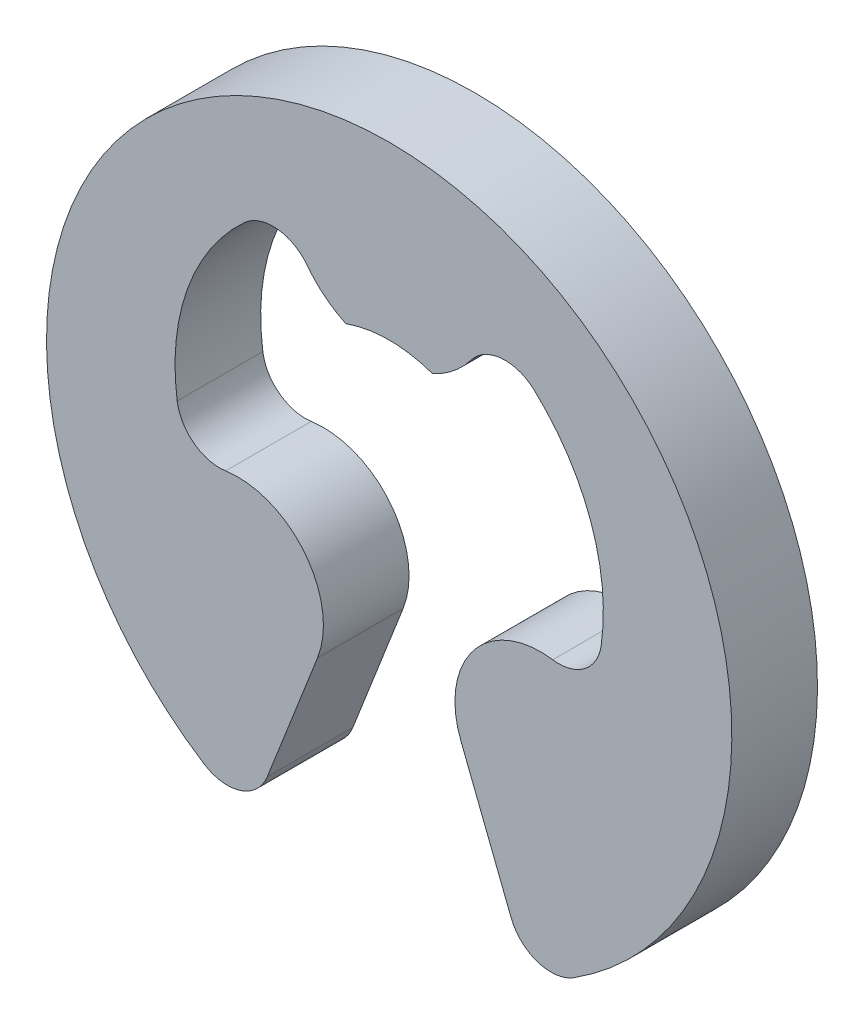
ISO-10303-21;
HEADER;
FILE_DESCRIPTION(('STEP AP214'),'2;1');
FILE_NAME('part.step','',(''),(''),'','','');
FILE_SCHEMA(('AUTOMOTIVE_DESIGN { 1 0 10303 214 1 1 1 1 }'));
ENDSEC;
DATA;
#1=APPLICATION_CONTEXT('core data for automotive mechanical design processes');
#2=APPLICATION_PROTOCOL_DEFINITION('international standard','automotive_design',2000,#1);
#3=PRODUCT_CONTEXT('',#1,'mechanical');
#4=PRODUCT('Part','Part','',(#3));
#5=PRODUCT_RELATED_PRODUCT_CATEGORY('part','',(#4));
#6=PRODUCT_DEFINITION_FORMATION('','',#4);
#7=PRODUCT_DEFINITION_CONTEXT('part definition',#1,'design');
#8=PRODUCT_DEFINITION('design','',#6,#7);
#9=PRODUCT_DEFINITION_SHAPE('','',#8);
#10=(LENGTH_UNIT() NAMED_UNIT(*) SI_UNIT(.MILLI.,.METRE.));
#11=(NAMED_UNIT(*) PLANE_ANGLE_UNIT() SI_UNIT($,.RADIAN.));
#12=(NAMED_UNIT(*) SI_UNIT($,.STERADIAN.) SOLID_ANGLE_UNIT());
#13=UNCERTAINTY_MEASURE_WITH_UNIT(LENGTH_MEASURE(1.E-05),#10,'distance_accuracy_value','');
#14=(GEOMETRIC_REPRESENTATION_CONTEXT(3) GLOBAL_UNCERTAINTY_ASSIGNED_CONTEXT((#13)) GLOBAL_UNIT_ASSIGNED_CONTEXT((#10,
#11,#12)) REPRESENTATION_CONTEXT('',''));
#15=CARTESIAN_POINT('',(0.,0.,0.));
#16=DIRECTION('',(0.,0.,1.));
#17=DIRECTION('',(1.,0.,0.));
#18=AXIS2_PLACEMENT_3D('',#15,#16,#17);
#19=CARTESIAN_POINT('',(0.676981535937281,0.736,0.5));
#20=DIRECTION('',(0.,0.,-1.));
#21=DIRECTION('',(-1.,0.,0.));
#22=AXIS2_PLACEMENT_3D('',#19,#20,#21);
#23=CYLINDRICAL_SURFACE('',#22,0.25);
#24=CARTESIAN_POINT('',(0.676981535937281,0.736,0.));
#25=DIRECTION('',(0.,0.,-1.));
#26=DIRECTION('',(-1.,0.,0.));
#27=AXIS2_PLACEMENT_3D('',#24,#25,#26);
#28=CIRCLE('',#27,0.25);
#29=CARTESIAN_POINT('',(0.47786931948514,0.887176470588235,0.));
#30=VERTEX_POINT('',#29);
#31=CARTESIAN_POINT('',(0.846226919921601,0.92,0.));
#32=VERTEX_POINT('',#31);
#33=EDGE_CURVE('E176',#30,#32,#28,.T.);
#34=ORIENTED_EDGE('',*,*,#33,.T.);
#35=DIRECTION('',(0.,0.,-1.));
#36=VECTOR('',#35,1.);
#37=CARTESIAN_POINT('',(0.846226919921601,0.92,0.5));
#38=LINE('',#37,#36);
#39=CARTESIAN_POINT('',(0.846226919921601,0.92,0.5));
#40=VERTEX_POINT('',#39);
#41=EDGE_CURVE('E11',#40,#32,#38,.T.);
#42=ORIENTED_EDGE('',*,*,#41,.F.);
#43=CARTESIAN_POINT('',(0.676981535937281,0.736,0.5));
#44=DIRECTION('',(0.,0.,-1.));
#45=DIRECTION('',(-1.,0.,0.));
#46=AXIS2_PLACEMENT_3D('',#43,#44,#45);
#47=CIRCLE('',#46,0.25);
#48=CARTESIAN_POINT('',(0.47786931948514,0.887176470588235,0.5));
#49=VERTEX_POINT('',#48);
#50=EDGE_CURVE('E206',#49,#40,#47,.T.);
#51=ORIENTED_EDGE('',*,*,#50,.F.);
#52=DIRECTION('',(0.,0.,-1.));
#53=VECTOR('',#52,1.);
#54=CARTESIAN_POINT('',(0.47786931948514,0.887176470588235,0.5));
#55=LINE('',#54,#53);
#56=EDGE_CURVE('E172',#49,#30,#55,.T.);
#57=ORIENTED_EDGE('',*,*,#56,.T.);
#58=EDGE_LOOP('',(#34,#42,#51,#57));
#59=FACE_BOUND('',#58,.T.);
#60=ADVANCED_FACE('F32',(#59),#23,.F.);
#61=CARTESIAN_POINT('',(0.,0.,0.5));
#62=DIRECTION('',(0.,0.,-1.));
#63=DIRECTION('',(-1.,0.,0.));
#64=AXIS2_PLACEMENT_3D('',#61,#62,#63);
#65=CYLINDRICAL_SURFACE('',#64,1.25);
#66=CARTESIAN_POINT('',(0.,0.,0.));
#67=DIRECTION('',(0.,0.,-1.));
#68=DIRECTION('',(-1.,0.,0.));
#69=AXIS2_PLACEMENT_3D('',#66,#67,#68);
#70=CIRCLE('',#69,1.25);
#71=CARTESIAN_POINT('',(1.23743686707646,-0.176776695296643,0.));
#72=VERTEX_POINT('',#71);
#73=EDGE_CURVE('E179',#32,#72,#70,.T.);
#74=ORIENTED_EDGE('',*,*,#73,.T.);
#75=DIRECTION('',(0.,0.,-1.));
#76=VECTOR('',#75,1.);
#77=CARTESIAN_POINT('',(1.23743686707646,-0.176776695296643,0.5));
#78=LINE('',#77,#76);
#79=CARTESIAN_POINT('',(1.23743686707646,-0.176776695296643,0.5));
#80=VERTEX_POINT('',#79);
#81=EDGE_CURVE('E40',#80,#72,#78,.T.);
#82=ORIENTED_EDGE('',*,*,#81,.F.);
#83=CARTESIAN_POINT('',(0.,0.,0.5));
#84=DIRECTION('',(0.,0.,-1.));
#85=DIRECTION('',(-1.,0.,0.));
#86=AXIS2_PLACEMENT_3D('',#83,#84,#85);
#87=CIRCLE('',#86,1.25);
#88=EDGE_CURVE('E115',#40,#80,#87,.T.);
#89=ORIENTED_EDGE('',*,*,#88,.F.);
#90=ORIENTED_EDGE('',*,*,#41,.T.);
#91=EDGE_LOOP('',(#74,#82,#89,#90));
#92=FACE_BOUND('',#91,.T.);
#93=ADVANCED_FACE('F304',(#92),#65,.F.);
#94=CARTESIAN_POINT('',(0.989949493661166,-0.141421356237314,0.5));
#95=DIRECTION('',(0.,0.,-1.));
#96=DIRECTION('',(-1.,0.,0.));
#97=AXIS2_PLACEMENT_3D('',#94,#95,#96);
#98=CYLINDRICAL_SURFACE('',#97,0.25);
#99=CARTESIAN_POINT('',(0.989949493661166,-0.141421356237314,0.));
#100=DIRECTION('',(0.,0.,-1.));
#101=DIRECTION('',(-1.,0.,0.));
#102=AXIS2_PLACEMENT_3D('',#99,#100,#101);
#103=CIRCLE('',#102,0.25);
#104=CARTESIAN_POINT('',(0.954594154601837,-0.388908729652606,0.));
#105=VERTEX_POINT('',#104);
#106=EDGE_CURVE('E181',#72,#105,#103,.T.);
#107=ORIENTED_EDGE('',*,*,#106,.T.);
#108=DIRECTION('',(0.,0.,-1.));
#109=VECTOR('',#108,1.);
#110=CARTESIAN_POINT('',(0.954594154601837,-0.388908729652606,0.5));
#111=LINE('',#110,#109);
#112=CARTESIAN_POINT('',(0.954594154601837,-0.388908729652606,0.5));
#113=VERTEX_POINT('',#112);
#114=EDGE_CURVE('E237',#113,#105,#111,.T.);
#115=ORIENTED_EDGE('',*,*,#114,.F.);
#116=CARTESIAN_POINT('',(0.989949493661166,-0.141421356237314,0.5));
#117=DIRECTION('',(0.,0.,-1.));
#118=DIRECTION('',(-1.,0.,0.));
#119=AXIS2_PLACEMENT_3D('',#116,#117,#118);
#120=CIRCLE('',#119,0.25);
#121=EDGE_CURVE('E245',#80,#113,#120,.T.);
#122=ORIENTED_EDGE('',*,*,#121,.F.);
#123=ORIENTED_EDGE('',*,*,#81,.T.);
#124=EDGE_LOOP('',(#107,#115,#122,#123));
#125=FACE_BOUND('',#124,.T.);
#126=ADVANCED_FACE('F243',(#125),#98,.F.);
#127=CARTESIAN_POINT('',(0.88388347648318,-0.883883476483189,0.5));
#128=DIRECTION('',(0.,0.,-1.));
#129=DIRECTION('',(-1.,0.,0.));
#130=AXIS2_PLACEMENT_3D('',#127,#128,#129);
#131=CYLINDRICAL_SURFACE('',#130,0.5);
#132=CARTESIAN_POINT('',(0.88388347648318,-0.883883476483189,0.));
#133=DIRECTION('',(0.,0.,1.));
#134=DIRECTION('',(-1.,0.,0.));
#135=AXIS2_PLACEMENT_3D('',#132,#133,#134);
#136=CIRCLE('',#135,0.5);
#137=CARTESIAN_POINT('',(0.418425085325476,-1.06649915516627,0.));
#138=VERTEX_POINT('',#137);
#139=EDGE_CURVE('E183',#105,#138,#136,.T.);
#140=ORIENTED_EDGE('',*,*,#139,.T.);
#141=DIRECTION('',(0.,0.,-1.));
#142=VECTOR('',#141,1.);
#143=CARTESIAN_POINT('',(0.418425085325476,-1.06649915516627,0.5));
#144=LINE('',#143,#142);
#145=CARTESIAN_POINT('',(0.418425085325476,-1.06649915516627,0.5));
#146=VERTEX_POINT('',#145);
#147=EDGE_CURVE('E234',#146,#138,#144,.T.);
#148=ORIENTED_EDGE('',*,*,#147,.F.);
#149=CARTESIAN_POINT('',(0.88388347648318,-0.883883476483189,0.5));
#150=DIRECTION('',(0.,0.,1.));
#151=DIRECTION('',(-1.,0.,0.));
#152=AXIS2_PLACEMENT_3D('',#149,#150,#151);
#153=CIRCLE('',#152,0.5);
#154=EDGE_CURVE('E263',#113,#146,#153,.T.);
#155=ORIENTED_EDGE('',*,*,#154,.F.);
#156=ORIENTED_EDGE('',*,*,#114,.T.);
#157=EDGE_LOOP('',(#140,#148,#155,#156));
#158=FACE_BOUND('',#157,.T.);
#159=ADVANCED_FACE('F254',(#158),#131,.T.);
#160=CARTESIAN_POINT('',(0.418425085325476,-1.06649915516627,0.5));
#161=DIRECTION('',(0.930916782315407,0.365231357366162,0.));
#162=DIRECTION('',(-0.365231357366162,0.930916782315407,0.));
#163=AXIS2_PLACEMENT_3D('',#160,#161,#162);
#164=PLANE('',#163);
#165=DIRECTION('',(0.365231357366162,-0.930916782315407,0.));
#166=VECTOR('',#165,1.);
#167=CARTESIAN_POINT('',(0.418425085325476,-1.06649915516627,0.));
#168=LINE('',#167,#166);
#169=CARTESIAN_POINT('',(0.711880973760569,-1.81447165507303,0.));
#170=VERTEX_POINT('',#169);
#171=EDGE_CURVE('E185',#138,#170,#168,.T.);
#172=ORIENTED_EDGE('',*,*,#171,.T.);
#173=DIRECTION('',(0.,0.,-1.));
#174=VECTOR('',#173,1.);
#175=CARTESIAN_POINT('',(0.711880973760569,-1.81447165507303,0.5));
#176=LINE('',#175,#174);
#177=CARTESIAN_POINT('',(0.711880973760569,-1.81447165507303,0.5));
#178=VERTEX_POINT('',#177);
#179=EDGE_CURVE('E231',#178,#170,#176,.T.);
#180=ORIENTED_EDGE('',*,*,#179,.F.);
#181=DIRECTION('',(0.365231357366162,-0.930916782315407,0.));
#182=VECTOR('',#181,1.);
#183=CARTESIAN_POINT('',(0.418425085325476,-1.06649915516627,0.5));
#184=LINE('',#183,#182);
#185=EDGE_CURVE('E260',#146,#178,#184,.T.);
#186=ORIENTED_EDGE('',*,*,#185,.F.);
#187=ORIENTED_EDGE('',*,*,#147,.T.);
#188=EDGE_LOOP('',(#172,#180,#186,#187));
#189=FACE_BOUND('',#188,.T.);
#190=ADVANCED_FACE('F258',(#189),#164,.F.);
#191=CARTESIAN_POINT('',(0.944610169339421,-1.72316381573149,0.5));
#192=DIRECTION('',(0.,0.,-1.));
#193=DIRECTION('',(-1.,0.,0.));
#194=AXIS2_PLACEMENT_3D('',#191,#192,#193);
#195=CYLINDRICAL_SURFACE('',#194,0.25);
#196=CARTESIAN_POINT('',(0.944610169339421,-1.72316381573149,0.));
#197=DIRECTION('',(0.,0.,1.));
#198=DIRECTION('',(-1.,0.,0.));
#199=AXIS2_PLACEMENT_3D('',#196,#197,#198);
#200=CIRCLE('',#199,0.25);
#201=CARTESIAN_POINT('',(1.07955447924505,-1.93361578940741,0.));
#202=VERTEX_POINT('',#201);
#203=EDGE_CURVE('E187',#170,#202,#200,.T.);
#204=ORIENTED_EDGE('',*,*,#203,.T.);
#205=DIRECTION('',(0.,0.,-1.));
#206=VECTOR('',#205,1.);
#207=CARTESIAN_POINT('',(1.07955447924505,-1.93361578940741,0.5));
#208=LINE('',#207,#206);
#209=CARTESIAN_POINT('',(1.07955447924505,-1.93361578940741,0.5));
#210=VERTEX_POINT('',#209);
#211=EDGE_CURVE('E228',#210,#202,#208,.T.);
#212=ORIENTED_EDGE('',*,*,#211,.F.);
#213=CARTESIAN_POINT('',(0.944610169339421,-1.72316381573149,0.5));
#214=DIRECTION('',(0.,0.,1.));
#215=DIRECTION('',(-1.,0.,0.));
#216=AXIS2_PLACEMENT_3D('',#213,#214,#215);
#217=CIRCLE('',#216,0.25);
#218=EDGE_CURVE('E262',#178,#210,#217,.T.);
#219=ORIENTED_EDGE('',*,*,#218,.F.);
#220=ORIENTED_EDGE('',*,*,#179,.T.);
#221=EDGE_LOOP('',(#204,#212,#219,#220));
#222=FACE_BOUND('',#221,.T.);
#223=ADVANCED_FACE('F317',(#222),#195,.T.);
#224=CARTESIAN_POINT('',(0.,-0.25,0.5));
#225=DIRECTION('',(0.,0.,-1.));
#226=DIRECTION('',(-1.,0.,0.));
#227=AXIS2_PLACEMENT_3D('',#224,#225,#226);
#228=CYLINDRICAL_SURFACE('',#227,2.);
#229=CARTESIAN_POINT('',(0.,-0.25,0.));
#230=DIRECTION('',(0.,0.,1.));
#231=DIRECTION('',(1.,0.,0.));
#232=AXIS2_PLACEMENT_3D('',#229,#230,#231);
#233=CIRCLE('',#232,2.);
#234=CARTESIAN_POINT('',(-1.07955447924505,-1.93361578940741,0.));
#235=VERTEX_POINT('',#234);
#236=EDGE_CURVE('E189',#202,#235,#233,.T.);
#237=ORIENTED_EDGE('',*,*,#236,.T.);
#238=DIRECTION('',(0.,0.,-1.));
#239=VECTOR('',#238,1.);
#240=CARTESIAN_POINT('',(-1.07955447924505,-1.93361578940741,0.5));
#241=LINE('',#240,#239);
#242=CARTESIAN_POINT('',(-1.07955447924505,-1.93361578940741,0.5));
#243=VERTEX_POINT('',#242);
#244=EDGE_CURVE('E225',#243,#235,#241,.T.);
#245=ORIENTED_EDGE('',*,*,#244,.F.);
#246=CARTESIAN_POINT('',(0.,-0.25,0.5));
#247=DIRECTION('',(0.,0.,1.));
#248=DIRECTION('',(1.,0.,0.));
#249=AXIS2_PLACEMENT_3D('',#246,#247,#248);
#250=CIRCLE('',#249,2.);
#251=EDGE_CURVE('E265',#210,#243,#250,.T.);
#252=ORIENTED_EDGE('',*,*,#251,.F.);
#253=ORIENTED_EDGE('',*,*,#211,.T.);
#254=EDGE_LOOP('',(#237,#245,#252,#253));
#255=FACE_BOUND('',#254,.T.);
#256=ADVANCED_FACE('F320',(#255),#228,.T.);
#257=CARTESIAN_POINT('',(-0.944610169339421,-1.72316381573149,0.5));
#258=DIRECTION('',(0.,0.,-1.));
#259=DIRECTION('',(-1.,0.,0.));
#260=AXIS2_PLACEMENT_3D('',#257,#258,#259);
#261=CYLINDRICAL_SURFACE('',#260,0.25);
#262=CARTESIAN_POINT('',(-0.944610169339421,-1.72316381573149,0.));
#263=DIRECTION('',(0.,0.,1.));
#264=DIRECTION('',(1.,0.,0.));
#265=AXIS2_PLACEMENT_3D('',#262,#263,#264);
#266=CIRCLE('',#265,0.25);
#267=CARTESIAN_POINT('',(-0.711880973760569,-1.81447165507303,0.));
#268=VERTEX_POINT('',#267);
#269=EDGE_CURVE('E191',#235,#268,#266,.T.);
#270=ORIENTED_EDGE('',*,*,#269,.T.);
#271=DIRECTION('',(0.,0.,-1.));
#272=VECTOR('',#271,1.);
#273=CARTESIAN_POINT('',(-0.711880973760569,-1.81447165507303,0.5));
#274=LINE('',#273,#272);
#275=CARTESIAN_POINT('',(-0.711880973760569,-1.81447165507303,0.5));
#276=VERTEX_POINT('',#275);
#277=EDGE_CURVE('E222',#276,#268,#274,.T.);
#278=ORIENTED_EDGE('',*,*,#277,.F.);
#279=CARTESIAN_POINT('',(-0.944610169339421,-1.72316381573149,0.5));
#280=DIRECTION('',(0.,0.,1.));
#281=DIRECTION('',(1.,0.,0.));
#282=AXIS2_PLACEMENT_3D('',#279,#280,#281);
#283=CIRCLE('',#282,0.25);
#284=EDGE_CURVE('E271',#243,#276,#283,.T.);
#285=ORIENTED_EDGE('',*,*,#284,.F.);
#286=ORIENTED_EDGE('',*,*,#244,.T.);
#287=EDGE_LOOP('',(#270,#278,#285,#286));
#288=FACE_BOUND('',#287,.T.);
#289=ADVANCED_FACE('F324',(#288),#261,.T.);
#290=CARTESIAN_POINT('',(-0.418425085325476,-1.06649915516627,0.5));
#291=DIRECTION('',(-0.930916782315407,0.365231357366162,0.));
#292=DIRECTION('',(-0.365231357366162,-0.930916782315407,0.));
#293=AXIS2_PLACEMENT_3D('',#290,#291,#292);
#294=PLANE('',#293);
#295=DIRECTION('',(0.365231357366162,0.930916782315407,0.));
#296=VECTOR('',#295,1.);
#297=CARTESIAN_POINT('',(-0.418425085325476,-1.06649915516627,0.));
#298=LINE('',#297,#296);
#299=CARTESIAN_POINT('',(-0.418425085325476,-1.06649915516627,0.));
#300=VERTEX_POINT('',#299);
#301=EDGE_CURVE('E193',#268,#300,#298,.T.);
#302=ORIENTED_EDGE('',*,*,#301,.T.);
#303=DIRECTION('',(0.,0.,-1.));
#304=VECTOR('',#303,1.);
#305=CARTESIAN_POINT('',(-0.418425085325476,-1.06649915516627,0.5));
#306=LINE('',#305,#304);
#307=CARTESIAN_POINT('',(-0.418425085325476,-1.06649915516627,0.5));
#308=VERTEX_POINT('',#307);
#309=EDGE_CURVE('E219',#308,#300,#306,.T.);
#310=ORIENTED_EDGE('',*,*,#309,.F.);
#311=DIRECTION('',(0.365231357366162,0.930916782315407,0.));
#312=VECTOR('',#311,1.);
#313=CARTESIAN_POINT('',(-0.418425085325476,-1.06649915516627,0.5));
#314=LINE('',#313,#312);
#315=EDGE_CURVE('E273',#276,#308,#314,.T.);
#316=ORIENTED_EDGE('',*,*,#315,.F.);
#317=ORIENTED_EDGE('',*,*,#277,.T.);
#318=EDGE_LOOP('',(#302,#310,#316,#317));
#319=FACE_BOUND('',#318,.T.);
#320=ADVANCED_FACE('F328',(#319),#294,.F.);
#321=CARTESIAN_POINT('',(-0.88388347648318,-0.883883476483189,0.5));
#322=DIRECTION('',(0.,0.,-1.));
#323=DIRECTION('',(-1.,0.,0.));
#324=AXIS2_PLACEMENT_3D('',#321,#322,#323);
#325=CYLINDRICAL_SURFACE('',#324,0.5);
#326=CARTESIAN_POINT('',(-0.88388347648318,-0.883883476483189,0.));
#327=DIRECTION('',(0.,0.,1.));
#328=DIRECTION('',(1.,0.,0.));
#329=AXIS2_PLACEMENT_3D('',#326,#327,#328);
#330=CIRCLE('',#329,0.5);
#331=CARTESIAN_POINT('',(-0.954594154601837,-0.388908729652606,0.));
#332=VERTEX_POINT('',#331);
#333=EDGE_CURVE('E195',#300,#332,#330,.T.);
#334=ORIENTED_EDGE('',*,*,#333,.T.);
#335=DIRECTION('',(0.,0.,-1.));
#336=VECTOR('',#335,1.);
#337=CARTESIAN_POINT('',(-0.954594154601837,-0.388908729652606,0.5));
#338=LINE('',#337,#336);
#339=CARTESIAN_POINT('',(-0.954594154601837,-0.388908729652606,0.5));
#340=VERTEX_POINT('',#339);
#341=EDGE_CURVE('E216',#340,#332,#338,.T.);
#342=ORIENTED_EDGE('',*,*,#341,.F.);
#343=CARTESIAN_POINT('',(-0.88388347648318,-0.883883476483189,0.5));
#344=DIRECTION('',(0.,0.,1.));
#345=DIRECTION('',(1.,0.,0.));
#346=AXIS2_PLACEMENT_3D('',#343,#344,#345);
#347=CIRCLE('',#346,0.5);
#348=EDGE_CURVE('E275',#308,#340,#347,.T.);
#349=ORIENTED_EDGE('',*,*,#348,.F.);
#350=ORIENTED_EDGE('',*,*,#309,.T.);
#351=EDGE_LOOP('',(#334,#342,#349,#350));
#352=FACE_BOUND('',#351,.T.);
#353=ADVANCED_FACE('F332',(#352),#325,.T.);
#354=CARTESIAN_POINT('',(-0.989949493661166,-0.141421356237314,0.5));
#355=DIRECTION('',(0.,0.,-1.));
#356=DIRECTION('',(-1.,0.,0.));
#357=AXIS2_PLACEMENT_3D('',#354,#355,#356);
#358=CYLINDRICAL_SURFACE('',#357,0.25);
#359=CARTESIAN_POINT('',(-0.989949493661166,-0.141421356237314,0.));
#360=DIRECTION('',(0.,0.,-1.));
#361=DIRECTION('',(1.,0.,0.));
#362=AXIS2_PLACEMENT_3D('',#359,#360,#361);
#363=CIRCLE('',#362,0.25);
#364=CARTESIAN_POINT('',(-1.23743686707646,-0.176776695296642,0.));
#365=VERTEX_POINT('',#364);
#366=EDGE_CURVE('E197',#332,#365,#363,.T.);
#367=ORIENTED_EDGE('',*,*,#366,.T.);
#368=DIRECTION('',(0.,0.,-1.));
#369=VECTOR('',#368,1.);
#370=CARTESIAN_POINT('',(-1.23743686707646,-0.176776695296642,0.5));
#371=LINE('',#370,#369);
#372=CARTESIAN_POINT('',(-1.23743686707646,-0.176776695296642,0.5));
#373=VERTEX_POINT('',#372);
#374=EDGE_CURVE('E213',#373,#365,#371,.T.);
#375=ORIENTED_EDGE('',*,*,#374,.F.);
#376=CARTESIAN_POINT('',(-0.989949493661166,-0.141421356237314,0.5));
#377=DIRECTION('',(0.,0.,-1.));
#378=DIRECTION('',(1.,0.,0.));
#379=AXIS2_PLACEMENT_3D('',#376,#377,#378);
#380=CIRCLE('',#379,0.25);
#381=EDGE_CURVE('E277',#340,#373,#380,.T.);
#382=ORIENTED_EDGE('',*,*,#381,.F.);
#383=ORIENTED_EDGE('',*,*,#341,.T.);
#384=EDGE_LOOP('',(#367,#375,#382,#383));
#385=FACE_BOUND('',#384,.T.);
#386=ADVANCED_FACE('F336',(#385),#358,.F.);
#387=CARTESIAN_POINT('',(0.,0.,0.5));
#388=DIRECTION('',(0.,0.,-1.));
#389=DIRECTION('',(-1.,0.,0.));
#390=AXIS2_PLACEMENT_3D('',#387,#388,#389);
#391=CYLINDRICAL_SURFACE('',#390,1.25);
#392=CARTESIAN_POINT('',(0.,0.,0.));
#393=DIRECTION('',(0.,0.,-1.));
#394=DIRECTION('',(1.,0.,0.));
#395=AXIS2_PLACEMENT_3D('',#392,#393,#394);
#396=CIRCLE('',#395,1.25);
#397=CARTESIAN_POINT('',(-0.846226919921601,0.92,0.));
#398=VERTEX_POINT('',#397);
#399=EDGE_CURVE('E199',#365,#398,#396,.T.);
#400=ORIENTED_EDGE('',*,*,#399,.T.);
#401=DIRECTION('',(0.,0.,-1.));
#402=VECTOR('',#401,1.);
#403=CARTESIAN_POINT('',(-0.846226919921601,0.92,0.5));
#404=LINE('',#403,#402);
#405=CARTESIAN_POINT('',(-0.846226919921601,0.92,0.5));
#406=VERTEX_POINT('',#405);
#407=EDGE_CURVE('E210',#406,#398,#404,.T.);
#408=ORIENTED_EDGE('',*,*,#407,.F.);
#409=CARTESIAN_POINT('',(0.,0.,0.5));
#410=DIRECTION('',(0.,0.,-1.));
#411=DIRECTION('',(1.,0.,0.));
#412=AXIS2_PLACEMENT_3D('',#409,#410,#411);
#413=CIRCLE('',#412,1.25);
#414=EDGE_CURVE('E279',#373,#406,#413,.T.);
#415=ORIENTED_EDGE('',*,*,#414,.F.);
#416=ORIENTED_EDGE('',*,*,#374,.T.);
#417=EDGE_LOOP('',(#400,#408,#415,#416));
#418=FACE_BOUND('',#417,.T.);
#419=ADVANCED_FACE('F285',(#418),#391,.F.);
#420=CARTESIAN_POINT('',(-0.676981535937281,0.736,0.5));
#421=DIRECTION('',(0.,0.,-1.));
#422=DIRECTION('',(-1.,0.,0.));
#423=AXIS2_PLACEMENT_3D('',#420,#421,#422);
#424=CYLINDRICAL_SURFACE('',#423,0.25);
#425=CARTESIAN_POINT('',(-0.676981535937281,0.736,0.));
#426=DIRECTION('',(0.,0.,-1.));
#427=DIRECTION('',(1.,0.,0.));
#428=AXIS2_PLACEMENT_3D('',#425,#426,#427);
#429=CIRCLE('',#428,0.25);
#430=CARTESIAN_POINT('',(-0.47786931948514,0.887176470588235,0.));
#431=VERTEX_POINT('',#430);
#432=EDGE_CURVE('E201',#398,#431,#429,.T.);
#433=ORIENTED_EDGE('',*,*,#432,.T.);
#434=DIRECTION('',(0.,0.,-1.));
#435=VECTOR('',#434,1.);
#436=CARTESIAN_POINT('',(-0.47786931948514,0.887176470588235,0.5));
#437=LINE('',#436,#435);
#438=CARTESIAN_POINT('',(-0.47786931948514,0.887176470588235,0.5));
#439=VERTEX_POINT('',#438);
#440=EDGE_CURVE('E167',#439,#431,#437,.T.);
#441=ORIENTED_EDGE('',*,*,#440,.F.);
#442=CARTESIAN_POINT('',(-0.676981535937281,0.736,0.5));
#443=DIRECTION('',(0.,0.,-1.));
#444=DIRECTION('',(1.,0.,0.));
#445=AXIS2_PLACEMENT_3D('',#442,#443,#444);
#446=CIRCLE('',#445,0.25);
#447=EDGE_CURVE('E158',#406,#439,#446,.T.);
#448=ORIENTED_EDGE('',*,*,#447,.F.);
#449=ORIENTED_EDGE('',*,*,#407,.T.);
#450=EDGE_LOOP('',(#433,#441,#448,#449));
#451=FACE_BOUND('',#450,.T.);
#452=ADVANCED_FACE('F289',(#451),#424,.F.);
#453=CARTESIAN_POINT('',(0.,1.25,0.5));
#454=DIRECTION('',(0.,0.,-1.));
#455=DIRECTION('',(-1.,0.,0.));
#456=AXIS2_PLACEMENT_3D('',#453,#454,#455);
#457=CYLINDRICAL_SURFACE('',#456,0.6);
#458=CARTESIAN_POINT('',(0.,1.25,0.));
#459=DIRECTION('',(0.,0.,1.));
#460=DIRECTION('',(1.,0.,0.));
#461=AXIS2_PLACEMENT_3D('',#458,#459,#460);
#462=CIRCLE('',#461,0.6);
#463=CARTESIAN_POINT('',(-0.253108672312902,0.706,0.));
#464=VERTEX_POINT('',#463);
#465=EDGE_CURVE('E166',#431,#464,#462,.T.);
#466=ORIENTED_EDGE('',*,*,#465,.T.);
#467=DIRECTION('',(0.,0.,-1.));
#468=VECTOR('',#467,1.);
#469=CARTESIAN_POINT('',(-0.253108672312902,0.706,0.5));
#470=LINE('',#469,#468);
#471=CARTESIAN_POINT('',(-0.253108672312902,0.706,0.5));
#472=VERTEX_POINT('',#471);
#473=EDGE_CURVE('E163',#472,#464,#470,.T.);
#474=ORIENTED_EDGE('',*,*,#473,.F.);
#475=CARTESIAN_POINT('',(0.,1.25,0.5));
#476=DIRECTION('',(0.,0.,1.));
#477=DIRECTION('',(1.,0.,0.));
#478=AXIS2_PLACEMENT_3D('',#475,#476,#477);
#479=CIRCLE('',#478,0.6);
#480=EDGE_CURVE('E152',#439,#472,#479,.T.);
#481=ORIENTED_EDGE('',*,*,#480,.F.);
#482=ORIENTED_EDGE('',*,*,#440,.T.);
#483=EDGE_LOOP('',(#466,#474,#481,#482));
#484=FACE_BOUND('',#483,.T.);
#485=ADVANCED_FACE('F164',(#484),#457,.T.);
#486=CARTESIAN_POINT('',(0.,0.,0.5));
#487=DIRECTION('',(0.,0.,-1.));
#488=DIRECTION('',(-1.,0.,0.));
#489=AXIS2_PLACEMENT_3D('',#486,#487,#488);
#490=CYLINDRICAL_SURFACE('',#489,0.75);
#491=CARTESIAN_POINT('',(0.,0.,0.));
#492=DIRECTION('',(0.,0.,-1.));
#493=DIRECTION('',(1.,0.,0.));
#494=AXIS2_PLACEMENT_3D('',#491,#492,#493);
#495=CIRCLE('',#494,0.75);
#496=CARTESIAN_POINT('',(0.253108672312902,0.706,0.));
#497=VERTEX_POINT('',#496);
#498=EDGE_CURVE('E101',#464,#497,#495,.T.);
#499=ORIENTED_EDGE('',*,*,#498,.T.);
#500=DIRECTION('',(0.,0.,-1.));
#501=VECTOR('',#500,1.);
#502=CARTESIAN_POINT('',(0.253108672312902,0.706,0.5));
#503=LINE('',#502,#501);
#504=CARTESIAN_POINT('',(0.253108672312902,0.706,0.5));
#505=VERTEX_POINT('',#504);
#506=EDGE_CURVE('E168',#505,#497,#503,.T.);
#507=ORIENTED_EDGE('',*,*,#506,.F.);
#508=CARTESIAN_POINT('',(0.,0.,0.5));
#509=DIRECTION('',(0.,0.,-1.));
#510=DIRECTION('',(1.,0.,0.));
#511=AXIS2_PLACEMENT_3D('',#508,#509,#510);
#512=CIRCLE('',#511,0.75);
#513=EDGE_CURVE('E156',#472,#505,#512,.T.);
#514=ORIENTED_EDGE('',*,*,#513,.F.);
#515=ORIENTED_EDGE('',*,*,#473,.T.);
#516=EDGE_LOOP('',(#499,#507,#514,#515));
#517=FACE_BOUND('',#516,.T.);
#518=ADVANCED_FACE('F170',(#517),#490,.F.);
#519=CARTESIAN_POINT('',(0.,1.25,0.5));
#520=DIRECTION('',(0.,0.,-1.));
#521=DIRECTION('',(-1.,0.,0.));
#522=AXIS2_PLACEMENT_3D('',#519,#520,#521);
#523=CYLINDRICAL_SURFACE('',#522,0.6);
#524=CARTESIAN_POINT('',(0.,1.25,0.));
#525=DIRECTION('',(0.,0.,1.));
#526=DIRECTION('',(-1.,0.,0.));
#527=AXIS2_PLACEMENT_3D('',#524,#525,#526);
#528=CIRCLE('',#527,0.6);
#529=EDGE_CURVE('E107',#497,#30,#528,.T.);
#530=ORIENTED_EDGE('',*,*,#529,.T.);
#531=ORIENTED_EDGE('',*,*,#56,.F.);
#532=CARTESIAN_POINT('',(0.,1.25,0.5));
#533=DIRECTION('',(0.,0.,1.));
#534=DIRECTION('',(-1.,0.,0.));
#535=AXIS2_PLACEMENT_3D('',#532,#533,#534);
#536=CIRCLE('',#535,0.6);
#537=EDGE_CURVE('E48',#505,#49,#536,.T.);
#538=ORIENTED_EDGE('',*,*,#537,.F.);
#539=ORIENTED_EDGE('',*,*,#506,.T.);
#540=EDGE_LOOP('',(#530,#531,#538,#539));
#541=FACE_BOUND('',#540,.T.);
#542=ADVANCED_FACE('F293',(#541),#523,.T.);
#543=CARTESIAN_POINT('',(0.676981535937281,0.736,0.5));
#544=DIRECTION('',(0.,0.,-1.));
#545=DIRECTION('',(-1.,0.,0.));
#546=AXIS2_PLACEMENT_3D('',#543,#544,#545);
#547=PLANE('',#546);
#548=ORIENTED_EDGE('',*,*,#50,.T.);
#549=ORIENTED_EDGE('',*,*,#88,.T.);
#550=ORIENTED_EDGE('',*,*,#121,.T.);
#551=ORIENTED_EDGE('',*,*,#154,.T.);
#552=ORIENTED_EDGE('',*,*,#185,.T.);
#553=ORIENTED_EDGE('',*,*,#218,.T.);
#554=ORIENTED_EDGE('',*,*,#251,.T.);
#555=ORIENTED_EDGE('',*,*,#284,.T.);
#556=ORIENTED_EDGE('',*,*,#315,.T.);
#557=ORIENTED_EDGE('',*,*,#348,.T.);
#558=ORIENTED_EDGE('',*,*,#381,.T.);
#559=ORIENTED_EDGE('',*,*,#414,.T.);
#560=ORIENTED_EDGE('',*,*,#447,.T.);
#561=ORIENTED_EDGE('',*,*,#480,.T.);
#562=ORIENTED_EDGE('',*,*,#513,.T.);
#563=ORIENTED_EDGE('',*,*,#537,.T.);
#564=EDGE_LOOP('',(#548,#549,#550,#551,#552,#553,#554,#555,#556,#557,#558,#559,#560,#561,#562,#563));
#565=FACE_BOUND('',#564,.T.);
#566=ADVANCED_FACE('F154',(#565),#547,.F.);
#567=CARTESIAN_POINT('',(0.676981535937281,0.736,0.));
#568=DIRECTION('',(0.,0.,-1.));
#569=DIRECTION('',(-1.,0.,0.));
#570=AXIS2_PLACEMENT_3D('',#567,#568,#569);
#571=PLANE('',#570);
#572=ORIENTED_EDGE('',*,*,#33,.F.);
#573=ORIENTED_EDGE('',*,*,#529,.F.);
#574=ORIENTED_EDGE('',*,*,#498,.F.);
#575=ORIENTED_EDGE('',*,*,#465,.F.);
#576=ORIENTED_EDGE('',*,*,#432,.F.);
#577=ORIENTED_EDGE('',*,*,#399,.F.);
#578=ORIENTED_EDGE('',*,*,#366,.F.);
#579=ORIENTED_EDGE('',*,*,#333,.F.);
#580=ORIENTED_EDGE('',*,*,#301,.F.);
#581=ORIENTED_EDGE('',*,*,#269,.F.);
#582=ORIENTED_EDGE('',*,*,#236,.F.);
#583=ORIENTED_EDGE('',*,*,#203,.F.);
#584=ORIENTED_EDGE('',*,*,#171,.F.);
#585=ORIENTED_EDGE('',*,*,#139,.F.);
#586=ORIENTED_EDGE('',*,*,#106,.F.);
#587=ORIENTED_EDGE('',*,*,#73,.F.);
#588=EDGE_LOOP('',(#572,#573,#574,#575,#576,#577,#578,#579,#580,#581,#582,#583,#584,#585,#586,#587));
#589=FACE_BOUND('',#588,.T.);
#590=ADVANCED_FACE('F249',(#589),#571,.T.);
#591=CLOSED_SHELL('',(#60,#93,#126,#159,#190,#223,#256,#289,#320,#353,#386,#419,#452,#485,#518,
#542,#566,#590));
#592=MANIFOLD_SOLID_BREP('B2',#591);
#593=ADVANCED_BREP_SHAPE_REPRESENTATION('',(#18,#592),#14);
#594=SHAPE_DEFINITION_REPRESENTATION(#9,#593);
ENDSEC;
END-ISO-10303-21;
